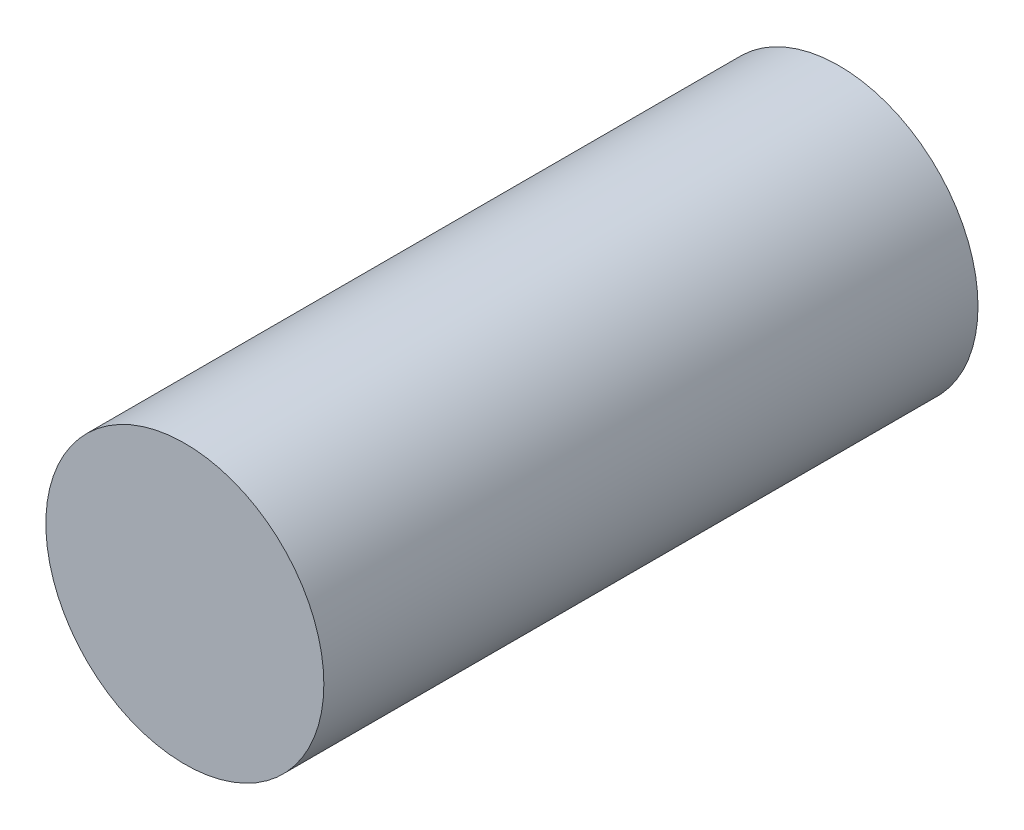
ISO-10303-21;
HEADER;
FILE_DESCRIPTION(('STEP AP214'),'2;1');
FILE_NAME('part.step','',(''),(''),'','','');
FILE_SCHEMA(('AUTOMOTIVE_DESIGN { 1 0 10303 214 1 1 1 1 }'));
ENDSEC;
DATA;
#1=APPLICATION_CONTEXT('core data for automotive mechanical design processes');
#2=APPLICATION_PROTOCOL_DEFINITION('international standard','automotive_design',2000,#1);
#3=PRODUCT_CONTEXT('',#1,'mechanical');
#4=PRODUCT('Part','Part','',(#3));
#5=PRODUCT_RELATED_PRODUCT_CATEGORY('part','',(#4));
#6=PRODUCT_DEFINITION_FORMATION('','',#4);
#7=PRODUCT_DEFINITION_CONTEXT('part definition',#1,'design');
#8=PRODUCT_DEFINITION('design','',#6,#7);
#9=PRODUCT_DEFINITION_SHAPE('','',#8);
#10=(LENGTH_UNIT() NAMED_UNIT(*) SI_UNIT(.MILLI.,.METRE.));
#11=(NAMED_UNIT(*) PLANE_ANGLE_UNIT() SI_UNIT($,.RADIAN.));
#12=(NAMED_UNIT(*) SI_UNIT($,.STERADIAN.) SOLID_ANGLE_UNIT());
#13=UNCERTAINTY_MEASURE_WITH_UNIT(LENGTH_MEASURE(1.E-05),#10,'distance_accuracy_value','');
#14=(GEOMETRIC_REPRESENTATION_CONTEXT(3) GLOBAL_UNCERTAINTY_ASSIGNED_CONTEXT((#13)) GLOBAL_UNIT_ASSIGNED_CONTEXT((#10,
#11,#12)) REPRESENTATION_CONTEXT('',''));
#15=CARTESIAN_POINT('',(0.,0.,0.));
#16=DIRECTION('',(0.,0.,1.));
#17=DIRECTION('',(1.,0.,0.));
#18=AXIS2_PLACEMENT_3D('',#15,#16,#17);
#19=CARTESIAN_POINT('',(0.,0.,40.));
#20=DIRECTION('',(0.,0.,-1.));
#21=DIRECTION('',(-1.,0.,0.));
#22=AXIS2_PLACEMENT_3D('',#19,#20,#21);
#23=CYLINDRICAL_SURFACE('',#22,17.);
#24=DIRECTION('',(0.,0.,-1.));
#25=VECTOR('',#24,1.);
#26=CARTESIAN_POINT('',(-4.99999999999999,-16.2480768092719,40.));
#27=LINE('',#26,#25);
#28=CARTESIAN_POINT('',(-4.99999999999999,-16.2480768092719,5.));
#29=VERTEX_POINT('',#28);
#30=CARTESIAN_POINT('',(-4.99999999999999,-16.2480768092719,-5.));
#31=VERTEX_POINT('',#30);
#32=EDGE_CURVE('E50',#29,#31,#27,.T.);
#33=ORIENTED_EDGE('',*,*,#32,.F.);
#34=CARTESIAN_POINT('',(0.,0.,5.));
#35=DIRECTION('',(0.,0.,1.));
#36=DIRECTION('',(1.,0.,0.));
#37=AXIS2_PLACEMENT_3D('',#34,#35,#36);
#38=CIRCLE('',#37,17.);
#39=CARTESIAN_POINT('',(5.00000000000001,-16.2480768092719,5.));
#40=VERTEX_POINT('',#39);
#41=EDGE_CURVE('E11',#29,#40,#38,.T.);
#42=ORIENTED_EDGE('',*,*,#41,.T.);
#43=DIRECTION('',(0.,0.,-1.));
#44=VECTOR('',#43,1.);
#45=CARTESIAN_POINT('',(5.00000000000001,-16.2480768092719,40.));
#46=LINE('',#45,#44);
#47=CARTESIAN_POINT('',(5.00000000000001,-16.2480768092719,-5.));
#48=VERTEX_POINT('',#47);
#49=EDGE_CURVE('E40',#48,#40,#46,.F.);
#50=ORIENTED_EDGE('',*,*,#49,.F.);
#51=CARTESIAN_POINT('',(0.,0.,-5.));
#52=DIRECTION('',(0.,0.,1.));
#53=DIRECTION('',(1.,0.,0.));
#54=AXIS2_PLACEMENT_3D('',#51,#52,#53);
#55=CIRCLE('',#54,17.);
#56=EDGE_CURVE('E105',#31,#48,#55,.T.);
#57=ORIENTED_EDGE('',*,*,#56,.F.);
#58=EDGE_LOOP('',(#33,#42,#50,#57));
#59=FACE_BOUND('',#58,.T.);
#60=CARTESIAN_POINT('',(0.,0.,40.));
#61=DIRECTION('',(0.,0.,1.));
#62=DIRECTION('',(1.,0.,0.));
#63=AXIS2_PLACEMENT_3D('',#60,#61,#62);
#64=CIRCLE('',#63,17.);
#65=CARTESIAN_POINT('',(17.,0.,40.));
#66=VERTEX_POINT('',#65);
#67=EDGE_CURVE('E102',#66,#66,#64,.T.);
#68=ORIENTED_EDGE('',*,*,#67,.F.);
#69=EDGE_LOOP('',(#68));
#70=FACE_BOUND('',#69,.T.);
#71=CARTESIAN_POINT('',(0.,0.,-40.));
#72=DIRECTION('',(0.,0.,1.));
#73=DIRECTION('',(1.,0.,0.));
#74=AXIS2_PLACEMENT_3D('',#71,#72,#73);
#75=CIRCLE('',#74,17.);
#76=CARTESIAN_POINT('',(17.,0.,-40.));
#77=VERTEX_POINT('',#76);
#78=EDGE_CURVE('E85',#77,#77,#75,.T.);
#79=ORIENTED_EDGE('',*,*,#78,.T.);
#80=EDGE_LOOP('',(#79));
#81=FACE_BOUND('',#80,.T.);
#82=ADVANCED_FACE('F33',(#59,#70,#81),#23,.T.);
#83=CARTESIAN_POINT('',(0.,0.,40.));
#84=DIRECTION('',(0.,0.,1.));
#85=DIRECTION('',(1.,0.,0.));
#86=AXIS2_PLACEMENT_3D('',#83,#84,#85);
#87=PLANE('',#86);
#88=ORIENTED_EDGE('',*,*,#67,.T.);
#89=EDGE_LOOP('',(#88));
#90=FACE_BOUND('',#89,.T.);
#91=ADVANCED_FACE('F141',(#90),#87,.T.);
#92=CARTESIAN_POINT('',(0.,0.,-40.));
#93=DIRECTION('',(0.,0.,1.));
#94=DIRECTION('',(1.,0.,0.));
#95=AXIS2_PLACEMENT_3D('',#92,#93,#94);
#96=PLANE('',#95);
#97=ORIENTED_EDGE('',*,*,#78,.F.);
#98=EDGE_LOOP('',(#97));
#99=FACE_BOUND('',#98,.T.);
#100=ADVANCED_FACE('F147',(#99),#96,.F.);
#101=CARTESIAN_POINT('',(5.00000000000001,-16.,5.));
#102=DIRECTION('',(-1.,0.,0.));
#103=DIRECTION('',(0.,0.,1.));
#104=AXIS2_PLACEMENT_3D('',#101,#102,#103);
#105=PLANE('',#104);
#106=DIRECTION('',(0.,1.,0.));
#107=VECTOR('',#106,1.);
#108=CARTESIAN_POINT('',(5.00000000000001,-16.,-5.));
#109=LINE('',#108,#107);
#110=CARTESIAN_POINT('',(5.00000000000001,-18.,-5.));
#111=VERTEX_POINT('',#110);
#112=EDGE_CURVE('E95',#111,#48,#109,.T.);
#113=ORIENTED_EDGE('',*,*,#112,.T.);
#114=ORIENTED_EDGE('',*,*,#49,.T.);
#115=DIRECTION('',(0.,1.,0.));
#116=VECTOR('',#115,1.);
#117=CARTESIAN_POINT('',(5.00000000000001,-16.,5.));
#118=LINE('',#117,#116);
#119=CARTESIAN_POINT('',(5.00000000000001,-18.,5.));
#120=VERTEX_POINT('',#119);
#121=EDGE_CURVE('E76',#120,#40,#118,.T.);
#122=ORIENTED_EDGE('',*,*,#121,.F.);
#123=DIRECTION('',(0.,0.,-1.));
#124=VECTOR('',#123,1.);
#125=CARTESIAN_POINT('',(5.00000000000001,-18.,5.));
#126=LINE('',#125,#124);
#127=EDGE_CURVE('E86',#120,#111,#126,.T.);
#128=ORIENTED_EDGE('',*,*,#127,.T.);
#129=EDGE_LOOP('',(#113,#114,#122,#128));
#130=FACE_BOUND('',#129,.T.);
#131=ADVANCED_FACE('F111',(#130),#105,.F.);
#132=CARTESIAN_POINT('',(-4.99999999999999,-16.,5.));
#133=DIRECTION('',(1.,0.,0.));
#134=DIRECTION('',(0.,0.,-1.));
#135=AXIS2_PLACEMENT_3D('',#132,#133,#134);
#136=PLANE('',#135);
#137=DIRECTION('',(0.,-1.,0.));
#138=VECTOR('',#137,1.);
#139=CARTESIAN_POINT('',(-4.99999999999999,-16.,5.));
#140=LINE('',#139,#138);
#141=CARTESIAN_POINT('',(-4.99999999999999,-18.,5.));
#142=VERTEX_POINT('',#141);
#143=EDGE_CURVE('E68',#29,#142,#140,.T.);
#144=ORIENTED_EDGE('',*,*,#143,.F.);
#145=ORIENTED_EDGE('',*,*,#32,.T.);
#146=DIRECTION('',(0.,-1.,0.));
#147=VECTOR('',#146,1.);
#148=CARTESIAN_POINT('',(-4.99999999999999,-16.,-5.));
#149=LINE('',#148,#147);
#150=CARTESIAN_POINT('',(-4.99999999999999,-18.,-5.));
#151=VERTEX_POINT('',#150);
#152=EDGE_CURVE('E82',#31,#151,#149,.T.);
#153=ORIENTED_EDGE('',*,*,#152,.T.);
#154=DIRECTION('',(0.,0.,-1.));
#155=VECTOR('',#154,1.);
#156=CARTESIAN_POINT('',(-4.99999999999999,-18.,5.));
#157=LINE('',#156,#155);
#158=EDGE_CURVE('E79',#142,#151,#157,.T.);
#159=ORIENTED_EDGE('',*,*,#158,.F.);
#160=EDGE_LOOP('',(#144,#145,#153,#159));
#161=FACE_BOUND('',#160,.T.);
#162=ADVANCED_FACE('F80',(#161),#136,.F.);
#163=CARTESIAN_POINT('',(-4.99999999999999,-18.,5.));
#164=DIRECTION('',(0.,1.,0.));
#165=DIRECTION('',(0.,0.,1.));
#166=AXIS2_PLACEMENT_3D('',#163,#164,#165);
#167=PLANE('',#166);
#168=CARTESIAN_POINT('',(0.,-18.,0.));
#169=DIRECTION('',(0.,-1.,0.));
#170=DIRECTION('',(0.,0.,-1.));
#171=AXIS2_PLACEMENT_3D('',#168,#169,#170);
#172=CIRCLE('',#171,2.5);
#173=CARTESIAN_POINT('',(0.,-18.,-2.5));
#174=VERTEX_POINT('',#173);
#175=EDGE_CURVE('E114',#174,#174,#172,.T.);
#176=ORIENTED_EDGE('',*,*,#175,.F.);
#177=EDGE_LOOP('',(#176));
#178=FACE_BOUND('',#177,.T.);
#179=DIRECTION('',(1.,0.,0.));
#180=VECTOR('',#179,1.);
#181=CARTESIAN_POINT('',(-4.99999999999999,-18.,-5.));
#182=LINE('',#181,#180);
#183=EDGE_CURVE('E100',#151,#111,#182,.T.);
#184=ORIENTED_EDGE('',*,*,#183,.T.);
#185=ORIENTED_EDGE('',*,*,#127,.F.);
#186=DIRECTION('',(1.,0.,0.));
#187=VECTOR('',#186,1.);
#188=CARTESIAN_POINT('',(-4.99999999999999,-18.,5.));
#189=LINE('',#188,#187);
#190=EDGE_CURVE('E73',#142,#120,#189,.T.);
#191=ORIENTED_EDGE('',*,*,#190,.F.);
#192=ORIENTED_EDGE('',*,*,#158,.T.);
#193=EDGE_LOOP('',(#184,#185,#191,#192));
#194=FACE_BOUND('',#193,.T.);
#195=ADVANCED_FACE('F88',(#178,#194),#167,.F.);
#196=CARTESIAN_POINT('',(0.,0.,5.));
#197=DIRECTION('',(0.,0.,1.));
#198=DIRECTION('',(1.,0.,0.));
#199=AXIS2_PLACEMENT_3D('',#196,#197,#198);
#200=PLANE('',#199);
#201=ORIENTED_EDGE('',*,*,#41,.F.);
#202=ORIENTED_EDGE('',*,*,#143,.T.);
#203=ORIENTED_EDGE('',*,*,#190,.T.);
#204=ORIENTED_EDGE('',*,*,#121,.T.);
#205=EDGE_LOOP('',(#201,#202,#203,#204));
#206=FACE_BOUND('',#205,.T.);
#207=ADVANCED_FACE('F70',(#206),#200,.T.);
#208=CARTESIAN_POINT('',(0.,0.,-5.));
#209=DIRECTION('',(0.,0.,1.));
#210=DIRECTION('',(1.,0.,0.));
#211=AXIS2_PLACEMENT_3D('',#208,#209,#210);
#212=PLANE('',#211);
#213=ORIENTED_EDGE('',*,*,#152,.F.);
#214=ORIENTED_EDGE('',*,*,#56,.T.);
#215=ORIENTED_EDGE('',*,*,#112,.F.);
#216=ORIENTED_EDGE('',*,*,#183,.F.);
#217=EDGE_LOOP('',(#213,#214,#215,#216));
#218=FACE_BOUND('',#217,.T.);
#219=ADVANCED_FACE('F125',(#218),#212,.F.);
#220=CARTESIAN_POINT('',(0.,-8.,0.));
#221=DIRECTION('',(0.,-1.,0.));
#222=DIRECTION('',(0.,0.,-1.));
#223=AXIS2_PLACEMENT_3D('',#220,#221,#222);
#224=CYLINDRICAL_SURFACE('',#223,2.5);
#225=CARTESIAN_POINT('',(0.,-8.,0.));
#226=DIRECTION('',(0.,-1.,0.));
#227=DIRECTION('',(0.,0.,-1.));
#228=AXIS2_PLACEMENT_3D('',#225,#226,#227);
#229=CIRCLE('',#228,2.5);
#230=CARTESIAN_POINT('',(0.,-8.,-2.5));
#231=VERTEX_POINT('',#230);
#232=EDGE_CURVE('E98',#231,#231,#229,.T.);
#233=ORIENTED_EDGE('',*,*,#232,.F.);
#234=EDGE_LOOP('',(#233));
#235=FACE_BOUND('',#234,.T.);
#236=ORIENTED_EDGE('',*,*,#175,.T.);
#237=EDGE_LOOP('',(#236));
#238=FACE_BOUND('',#237,.T.);
#239=ADVANCED_FACE('F122',(#235,#238),#224,.F.);
#240=CARTESIAN_POINT('',(0.,-8.,0.));
#241=DIRECTION('',(0.,-1.,0.));
#242=DIRECTION('',(0.,0.,-1.));
#243=AXIS2_PLACEMENT_3D('',#240,#241,#242);
#244=PLANE('',#243);
#245=ORIENTED_EDGE('',*,*,#232,.T.);
#246=EDGE_LOOP('',(#245));
#247=FACE_BOUND('',#246,.T.);
#248=ADVANCED_FACE('F120',(#247),#244,.T.);
#249=CLOSED_SHELL('',(#82,#91,#100,#131,#162,#195,#207,#219,#239,#248));
#250=MANIFOLD_SOLID_BREP('B2',#249);
#251=ADVANCED_BREP_SHAPE_REPRESENTATION('',(#18,#250),#14);
#252=SHAPE_DEFINITION_REPRESENTATION(#9,#251);
ENDSEC;
END-ISO-10303-21;
